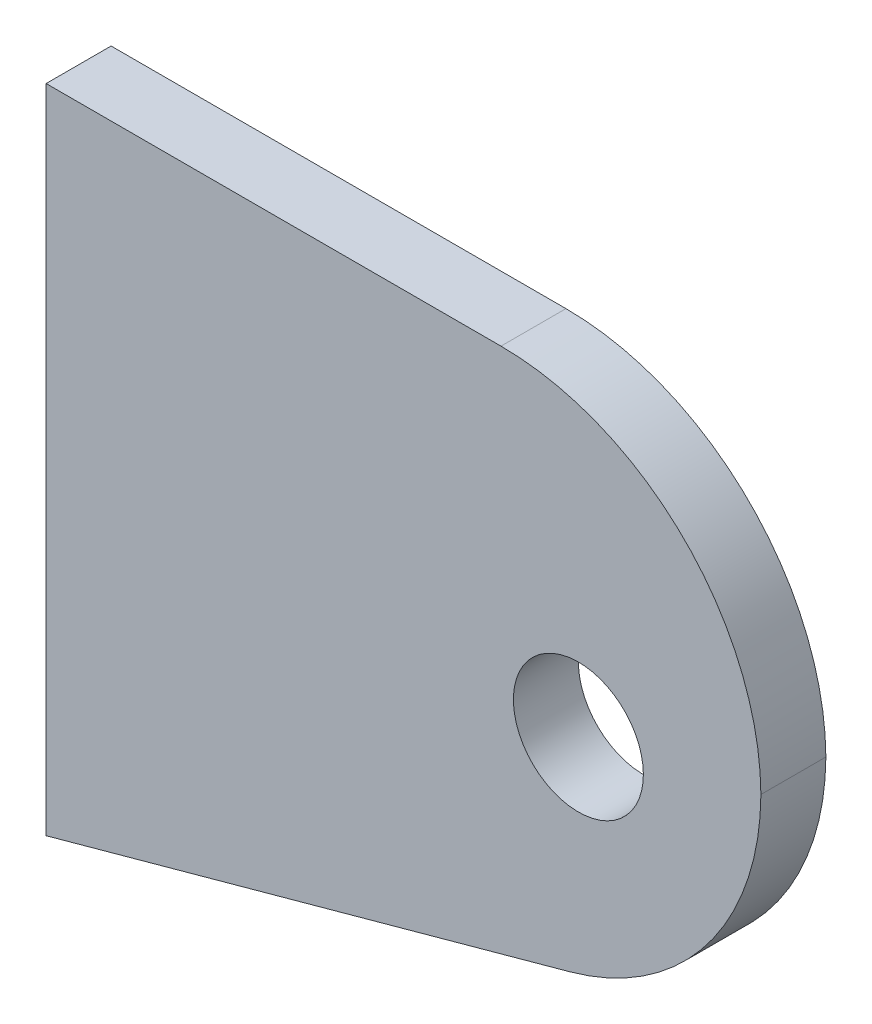
ISO-10303-21;
HEADER;
FILE_DESCRIPTION(('STEP AP214'),'2;1');
FILE_NAME('part.step','',(''),(''),'','','');
FILE_SCHEMA(('AUTOMOTIVE_DESIGN { 1 0 10303 214 1 1 1 1 }'));
ENDSEC;
DATA;
#1=APPLICATION_CONTEXT('core data for automotive mechanical design processes');
#2=APPLICATION_PROTOCOL_DEFINITION('international standard','automotive_design',2000,#1);
#3=PRODUCT_CONTEXT('',#1,'mechanical');
#4=PRODUCT('Part','Part','',(#3));
#5=PRODUCT_RELATED_PRODUCT_CATEGORY('part','',(#4));
#6=PRODUCT_DEFINITION_FORMATION('','',#4);
#7=PRODUCT_DEFINITION_CONTEXT('part definition',#1,'design');
#8=PRODUCT_DEFINITION('design','',#6,#7);
#9=PRODUCT_DEFINITION_SHAPE('','',#8);
#10=(LENGTH_UNIT() NAMED_UNIT(*) SI_UNIT(.MILLI.,.METRE.));
#11=(NAMED_UNIT(*) PLANE_ANGLE_UNIT() SI_UNIT($,.RADIAN.));
#12=(NAMED_UNIT(*) SI_UNIT($,.STERADIAN.) SOLID_ANGLE_UNIT());
#13=UNCERTAINTY_MEASURE_WITH_UNIT(LENGTH_MEASURE(1.E-05),#10,'distance_accuracy_value','');
#14=(GEOMETRIC_REPRESENTATION_CONTEXT(3) GLOBAL_UNCERTAINTY_ASSIGNED_CONTEXT((#13)) GLOBAL_UNIT_ASSIGNED_CONTEXT((#10,
#11,#12)) REPRESENTATION_CONTEXT('',''));
#15=CARTESIAN_POINT('',(0.,0.,0.));
#16=DIRECTION('',(0.,0.,1.));
#17=DIRECTION('',(1.,0.,0.));
#18=AXIS2_PLACEMENT_3D('',#15,#16,#17);
#19=CARTESIAN_POINT('',(-26.2895002274564,30.6045557345627,3.175));
#20=DIRECTION('',(1.,0.,0.));
#21=DIRECTION('',(0.,0.,-1.));
#22=AXIS2_PLACEMENT_3D('',#19,#20,#21);
#23=PLANE('',#22);
#24=DIRECTION('',(0.,0.,-1.));
#25=VECTOR('',#24,1.);
#26=CARTESIAN_POINT('',(-26.2895002274564,-1.22469226543733,3.175));
#27=LINE('',#26,#25);
#28=CARTESIAN_POINT('',(-26.2895002274564,-1.22469226543733,3.175));
#29=VERTEX_POINT('',#28);
#30=CARTESIAN_POINT('',(-26.2895002274564,-1.22469226543733,0.));
#31=VERTEX_POINT('',#30);
#32=EDGE_CURVE('E89',#29,#31,#27,.T.);
#33=ORIENTED_EDGE('',*,*,#32,.F.);
#34=DIRECTION('',(0.,-1.,0.));
#35=VECTOR('',#34,1.);
#36=CARTESIAN_POINT('',(-26.2895002274564,30.6045557345627,3.175));
#37=LINE('',#36,#35);
#38=CARTESIAN_POINT('',(-26.2895002274564,30.6045557345627,3.175));
#39=VERTEX_POINT('',#38);
#40=EDGE_CURVE('E97',#39,#29,#37,.T.);
#41=ORIENTED_EDGE('',*,*,#40,.F.);
#42=DIRECTION('',(0.,0.,-1.));
#43=VECTOR('',#42,1.);
#44=CARTESIAN_POINT('',(-26.2895002274564,30.6045557345627,3.175));
#45=LINE('',#44,#43);
#46=CARTESIAN_POINT('',(-26.2895002274564,30.6045557345627,0.));
#47=VERTEX_POINT('',#46);
#48=EDGE_CURVE('E108',#39,#47,#45,.T.);
#49=ORIENTED_EDGE('',*,*,#48,.T.);
#50=DIRECTION('',(0.,-1.,0.));
#51=VECTOR('',#50,1.);
#52=CARTESIAN_POINT('',(-26.2895002274564,30.6045557345627,0.));
#53=LINE('',#52,#51);
#54=EDGE_CURVE('E99',#47,#31,#53,.T.);
#55=ORIENTED_EDGE('',*,*,#54,.T.);
#56=EDGE_LOOP('',(#33,#41,#49,#55));
#57=FACE_BOUND('',#56,.T.);
#58=ADVANCED_FACE('F41',(#57),#23,.F.);
#59=CARTESIAN_POINT('',(0.,0.,3.175));
#60=DIRECTION('',(0.,0.,1.));
#61=DIRECTION('',(1.,0.,0.));
#62=AXIS2_PLACEMENT_3D('',#59,#60,#61);
#63=PLANE('',#62);
#64=CARTESIAN_POINT('',(-0.282440227456365,15.9553597345627,3.175));
#65=DIRECTION('',(0.,0.,1.));
#66=DIRECTION('',(1.,0.,0.));
#67=AXIS2_PLACEMENT_3D('',#64,#65,#66);
#68=CIRCLE('',#67,3.175);
#69=CARTESIAN_POINT('',(2.89255977254363,15.9553597345627,3.175));
#70=VERTEX_POINT('',#69);
#71=EDGE_CURVE('E100',#70,#70,#68,.T.);
#72=ORIENTED_EDGE('',*,*,#71,.F.);
#73=EDGE_LOOP('',(#72));
#74=FACE_BOUND('',#73,.T.);
#75=CARTESIAN_POINT('',(-4.06450022745636,18.0585571766068,3.175));
#76=DIRECTION('',(0.,0.,1.));
#77=DIRECTION('',(1.,0.,0.));
#78=AXIS2_PLACEMENT_3D('',#75,#76,#77);
#79=CIRCLE('',#78,12.7);
#80=CARTESIAN_POINT('',(-0.697054291178831,5.81313730359922,3.175));
#81=VERTEX_POINT('',#80);
#82=CARTESIAN_POINT('',(8.63526634082992,17.9815564555847,3.175));
#83=VERTEX_POINT('',#82);
#84=EDGE_CURVE('E57',#81,#83,#79,.T.);
#85=ORIENTED_EDGE('',*,*,#84,.T.);
#86=CARTESIAN_POINT('',(-4.06450022745636,17.9045557345627,3.175));
#87=DIRECTION('',(0.,0.,1.));
#88=DIRECTION('',(1.,0.,0.));
#89=AXIS2_PLACEMENT_3D('',#86,#87,#88);
#90=CIRCLE('',#89,12.7);
#91=CARTESIAN_POINT('',(-4.06450022745636,30.6045557345627,3.175));
#92=VERTEX_POINT('',#91);
#93=EDGE_CURVE('E50',#83,#92,#90,.T.);
#94=ORIENTED_EDGE('',*,*,#93,.T.);
#95=DIRECTION('',(-1.,0.,0.));
#96=VECTOR('',#95,1.);
#97=CARTESIAN_POINT('',(-26.2895002274564,30.6045557345627,3.175));
#98=LINE('',#97,#96);
#99=EDGE_CURVE('E104',#92,#39,#98,.T.);
#100=ORIENTED_EDGE('',*,*,#99,.T.);
#101=ORIENTED_EDGE('',*,*,#40,.T.);
#102=DIRECTION('',(-0.964206289213192,-0.26515322332894,0.));
#103=VECTOR('',#102,1.);
#104=CARTESIAN_POINT('',(-1.53520792736806,5.58264810147859,3.175));
#105=LINE('',#104,#103);
#106=EDGE_CURVE('E86',#81,#29,#105,.T.);
#107=ORIENTED_EDGE('',*,*,#106,.F.);
#108=EDGE_LOOP('',(#85,#94,#100,#101,#107));
#109=FACE_BOUND('',#108,.T.);
#110=ADVANCED_FACE('F102',(#74,#109),#63,.T.);
#111=CARTESIAN_POINT('',(0.,0.,0.));
#112=DIRECTION('',(0.,0.,1.));
#113=DIRECTION('',(1.,0.,0.));
#114=AXIS2_PLACEMENT_3D('',#111,#112,#113);
#115=PLANE('',#114);
#116=CARTESIAN_POINT('',(-0.282440227456365,15.9553597345627,0.));
#117=DIRECTION('',(0.,0.,1.));
#118=DIRECTION('',(1.,0.,0.));
#119=AXIS2_PLACEMENT_3D('',#116,#117,#118);
#120=CIRCLE('',#119,3.175);
#121=CARTESIAN_POINT('',(2.89255977254363,15.9553597345627,0.));
#122=VERTEX_POINT('',#121);
#123=EDGE_CURVE('E112',#122,#122,#120,.T.);
#124=ORIENTED_EDGE('',*,*,#123,.T.);
#125=EDGE_LOOP('',(#124));
#126=FACE_BOUND('',#125,.T.);
#127=DIRECTION('',(-1.,0.,0.));
#128=VECTOR('',#127,1.);
#129=CARTESIAN_POINT('',(-26.2895002274564,30.6045557345627,0.));
#130=LINE('',#129,#128);
#131=CARTESIAN_POINT('',(-4.06450022745636,30.6045557345627,0.));
#132=VERTEX_POINT('',#131);
#133=EDGE_CURVE('E106',#132,#47,#130,.T.);
#134=ORIENTED_EDGE('',*,*,#133,.F.);
#135=CARTESIAN_POINT('',(-4.06450022745636,17.9045557345627,0.));
#136=DIRECTION('',(0.,0.,1.));
#137=DIRECTION('',(1.,0.,0.));
#138=AXIS2_PLACEMENT_3D('',#135,#136,#137);
#139=CIRCLE('',#138,12.7);
#140=CARTESIAN_POINT('',(8.63526634082992,17.9815564555847,0.));
#141=VERTEX_POINT('',#140);
#142=EDGE_CURVE('E122',#132,#141,#139,.F.);
#143=ORIENTED_EDGE('',*,*,#142,.T.);
#144=CARTESIAN_POINT('',(-4.06450022745636,18.0585571766068,0.));
#145=DIRECTION('',(0.,0.,1.));
#146=DIRECTION('',(1.,0.,0.));
#147=AXIS2_PLACEMENT_3D('',#144,#145,#146);
#148=CIRCLE('',#147,12.7);
#149=CARTESIAN_POINT('',(-0.697054291178831,5.81313730359922,0.));
#150=VERTEX_POINT('',#149);
#151=EDGE_CURVE('E120',#141,#150,#148,.F.);
#152=ORIENTED_EDGE('',*,*,#151,.T.);
#153=DIRECTION('',(-0.964206289213192,-0.26515322332894,0.));
#154=VECTOR('',#153,1.);
#155=CARTESIAN_POINT('',(-1.53520792736806,5.58264810147859,0.));
#156=LINE('',#155,#154);
#157=EDGE_CURVE('E92',#150,#31,#156,.T.);
#158=ORIENTED_EDGE('',*,*,#157,.T.);
#159=ORIENTED_EDGE('',*,*,#54,.F.);
#160=EDGE_LOOP('',(#134,#143,#152,#158,#159));
#161=FACE_BOUND('',#160,.T.);
#162=ADVANCED_FACE('F135',(#126,#161),#115,.F.);
#163=CARTESIAN_POINT('',(-26.2895002274564,30.6045557345627,3.175));
#164=DIRECTION('',(0.,-1.,0.));
#165=DIRECTION('',(0.,0.,-1.));
#166=AXIS2_PLACEMENT_3D('',#163,#164,#165);
#167=PLANE('',#166);
#168=ORIENTED_EDGE('',*,*,#99,.F.);
#169=DIRECTION('',(0.,0.,-1.));
#170=VECTOR('',#169,1.);
#171=CARTESIAN_POINT('',(-4.06450022745636,30.6045557345627,3.175));
#172=LINE('',#171,#170);
#173=EDGE_CURVE('E117',#92,#132,#172,.T.);
#174=ORIENTED_EDGE('',*,*,#173,.T.);
#175=ORIENTED_EDGE('',*,*,#133,.T.);
#176=ORIENTED_EDGE('',*,*,#48,.F.);
#177=EDGE_LOOP('',(#168,#174,#175,#176));
#178=FACE_BOUND('',#177,.T.);
#179=ADVANCED_FACE('F130',(#178),#167,.F.);
#180=CARTESIAN_POINT('',(-0.282440227456365,15.9553597345627,3.175));
#181=DIRECTION('',(0.,0.,1.));
#182=DIRECTION('',(1.,0.,0.));
#183=AXIS2_PLACEMENT_3D('',#180,#181,#182);
#184=CYLINDRICAL_SURFACE('',#183,3.175);
#185=ORIENTED_EDGE('',*,*,#71,.T.);
#186=EDGE_LOOP('',(#185));
#187=FACE_BOUND('',#186,.T.);
#188=ORIENTED_EDGE('',*,*,#123,.F.);
#189=EDGE_LOOP('',(#188));
#190=FACE_BOUND('',#189,.T.);
#191=ADVANCED_FACE('F145',(#187,#190),#184,.F.);
#192=CARTESIAN_POINT('',(-1.53520792736806,5.58264810147859,3.175));
#193=DIRECTION('',(0.26515322332894,-0.964206289213192,0.));
#194=DIRECTION('',(0.964206289213192,0.26515322332894,0.));
#195=AXIS2_PLACEMENT_3D('',#192,#193,#194);
#196=PLANE('',#195);
#197=ORIENTED_EDGE('',*,*,#157,.F.);
#198=DIRECTION('',(0.,0.,-1.));
#199=VECTOR('',#198,1.);
#200=CARTESIAN_POINT('',(-0.697054291178832,5.81313730359922,3.175));
#201=LINE('',#200,#199);
#202=EDGE_CURVE('E11',#150,#81,#201,.F.);
#203=ORIENTED_EDGE('',*,*,#202,.T.);
#204=ORIENTED_EDGE('',*,*,#106,.T.);
#205=ORIENTED_EDGE('',*,*,#32,.T.);
#206=EDGE_LOOP('',(#197,#203,#204,#205));
#207=FACE_BOUND('',#206,.T.);
#208=ADVANCED_FACE('F88',(#207),#196,.T.);
#209=CARTESIAN_POINT('',(-4.06450022745636,18.0585571766068,3.175));
#210=DIRECTION('',(0.,0.,1.));
#211=DIRECTION('',(1.,0.,0.));
#212=AXIS2_PLACEMENT_3D('',#209,#210,#211);
#213=CYLINDRICAL_SURFACE('',#212,12.7);
#214=DIRECTION('',(0.,0.,1.));
#215=VECTOR('',#214,1.);
#216=CARTESIAN_POINT('',(8.63526634082992,17.9815564555847,1.5875));
#217=LINE('',#216,#215);
#218=EDGE_CURVE('E45',#83,#141,#217,.F.);
#219=ORIENTED_EDGE('',*,*,#218,.F.);
#220=ORIENTED_EDGE('',*,*,#84,.F.);
#221=ORIENTED_EDGE('',*,*,#202,.F.);
#222=ORIENTED_EDGE('',*,*,#151,.F.);
#223=EDGE_LOOP('',(#219,#220,#221,#222));
#224=FACE_BOUND('',#223,.T.);
#225=ADVANCED_FACE('F43',(#224),#213,.T.);
#226=CARTESIAN_POINT('',(-4.06450022745636,17.9045557345627,3.175));
#227=DIRECTION('',(0.,0.,-1.));
#228=DIRECTION('',(-1.,0.,0.));
#229=AXIS2_PLACEMENT_3D('',#226,#227,#228);
#230=CYLINDRICAL_SURFACE('',#229,12.7);
#231=ORIENTED_EDGE('',*,*,#93,.F.);
#232=ORIENTED_EDGE('',*,*,#218,.T.);
#233=ORIENTED_EDGE('',*,*,#142,.F.);
#234=ORIENTED_EDGE('',*,*,#173,.F.);
#235=EDGE_LOOP('',(#231,#232,#233,#234));
#236=FACE_BOUND('',#235,.T.);
#237=ADVANCED_FACE('F132',(#236),#230,.T.);
#238=CLOSED_SHELL('',(#58,#110,#162,#179,#191,#208,#225,#237));
#239=MANIFOLD_SOLID_BREP('B2',#238);
#240=ADVANCED_BREP_SHAPE_REPRESENTATION('',(#18,#239),#14);
#241=SHAPE_DEFINITION_REPRESENTATION(#9,#240);
ENDSEC;
END-ISO-10303-21;
